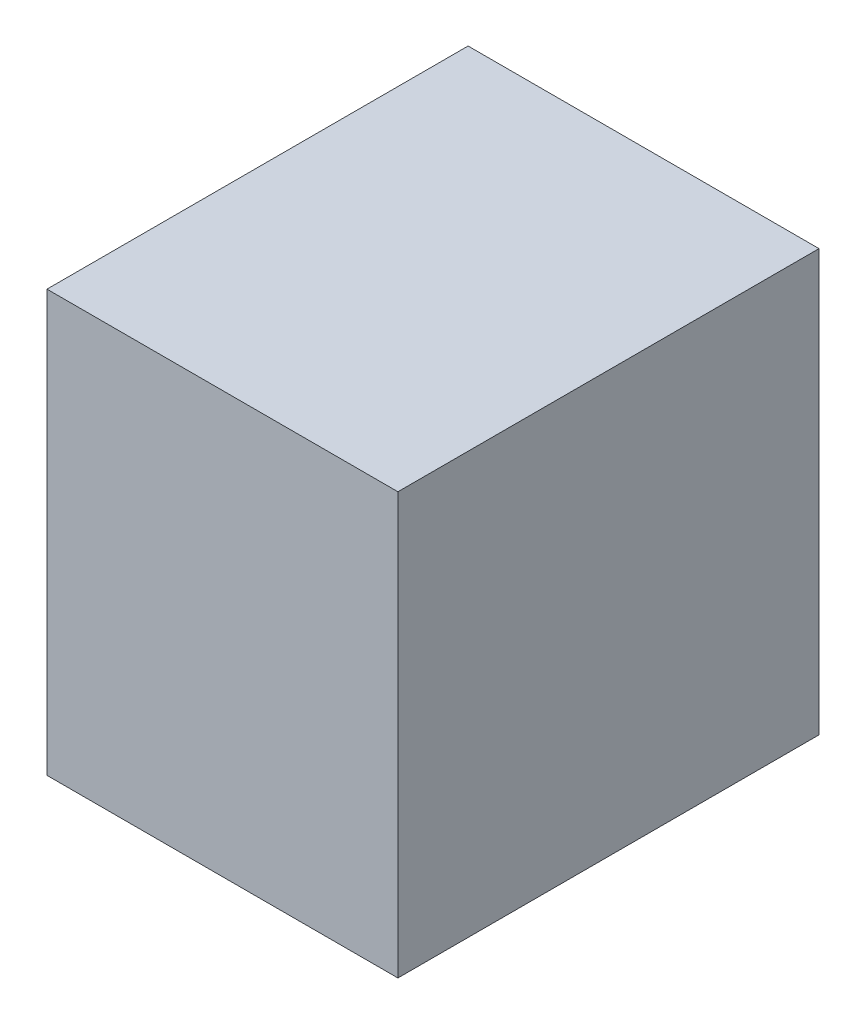
ISO-10303-21;
HEADER;
FILE_DESCRIPTION(('STEP AP214'),'2;1');
FILE_NAME('part.step','',(''),(''),'','','');
FILE_SCHEMA(('AUTOMOTIVE_DESIGN { 1 0 10303 214 1 1 1 1 }'));
ENDSEC;
DATA;
#1=APPLICATION_CONTEXT('core data for automotive mechanical design processes');
#2=APPLICATION_PROTOCOL_DEFINITION('international standard','automotive_design',2000,#1);
#3=PRODUCT_CONTEXT('',#1,'mechanical');
#4=PRODUCT('Part','Part','',(#3));
#5=PRODUCT_RELATED_PRODUCT_CATEGORY('part','',(#4));
#6=PRODUCT_DEFINITION_FORMATION('','',#4);
#7=PRODUCT_DEFINITION_CONTEXT('part definition',#1,'design');
#8=PRODUCT_DEFINITION('design','',#6,#7);
#9=PRODUCT_DEFINITION_SHAPE('','',#8);
#10=(LENGTH_UNIT() NAMED_UNIT(*) SI_UNIT(.MILLI.,.METRE.));
#11=(NAMED_UNIT(*) PLANE_ANGLE_UNIT() SI_UNIT($,.RADIAN.));
#12=(NAMED_UNIT(*) SI_UNIT($,.STERADIAN.) SOLID_ANGLE_UNIT());
#13=UNCERTAINTY_MEASURE_WITH_UNIT(LENGTH_MEASURE(1.E-05),#10,'distance_accuracy_value','');
#14=(GEOMETRIC_REPRESENTATION_CONTEXT(3) GLOBAL_UNCERTAINTY_ASSIGNED_CONTEXT((#13)) GLOBAL_UNIT_ASSIGNED_CONTEXT((#10,
#11,#12)) REPRESENTATION_CONTEXT('',''));
#15=CARTESIAN_POINT('',(0.,0.,0.));
#16=DIRECTION('',(0.,0.,1.));
#17=DIRECTION('',(1.,0.,0.));
#18=AXIS2_PLACEMENT_3D('',#15,#16,#17);
#19=CARTESIAN_POINT('',(325.,640.,-230.));
#20=DIRECTION('',(-1.,0.,0.));
#21=DIRECTION('',(0.,0.,1.));
#22=AXIS2_PLACEMENT_3D('',#19,#20,#21);
#23=PLANE('',#22);
#24=DIRECTION('',(0.,-1.,0.));
#25=VECTOR('',#24,1.);
#26=CARTESIAN_POINT('',(325.,640.,-170.));
#27=LINE('',#26,#25);
#28=CARTESIAN_POINT('',(325.,700.,-170.));
#29=VERTEX_POINT('',#28);
#30=CARTESIAN_POINT('',(325.,640.,-170.));
#31=VERTEX_POINT('',#30);
#32=EDGE_CURVE('E103',#29,#31,#27,.T.);
#33=ORIENTED_EDGE('',*,*,#32,.F.);
#34=DIRECTION('',(0.,0.,1.));
#35=VECTOR('',#34,1.);
#36=CARTESIAN_POINT('',(325.,700.,-230.));
#37=LINE('',#36,#35);
#38=CARTESIAN_POINT('',(325.,700.,-230.));
#39=VERTEX_POINT('',#38);
#40=EDGE_CURVE('E11',#39,#29,#37,.T.);
#41=ORIENTED_EDGE('',*,*,#40,.F.);
#42=DIRECTION('',(0.,-1.,0.));
#43=VECTOR('',#42,1.);
#44=CARTESIAN_POINT('',(325.,640.,-230.));
#45=LINE('',#44,#43);
#46=CARTESIAN_POINT('',(325.,640.,-230.));
#47=VERTEX_POINT('',#46);
#48=EDGE_CURVE('E97',#39,#47,#45,.T.);
#49=ORIENTED_EDGE('',*,*,#48,.T.);
#50=DIRECTION('',(0.,0.,1.));
#51=VECTOR('',#50,1.);
#52=CARTESIAN_POINT('',(325.,640.,-230.));
#53=LINE('',#52,#51);
#54=EDGE_CURVE('E42',#47,#31,#53,.T.);
#55=ORIENTED_EDGE('',*,*,#54,.T.);
#56=EDGE_LOOP('',(#33,#41,#49,#55));
#57=FACE_BOUND('',#56,.T.);
#58=ADVANCED_FACE('F39',(#57),#23,.T.);
#59=CARTESIAN_POINT('',(325.,700.,-230.));
#60=DIRECTION('',(0.,1.,0.));
#61=DIRECTION('',(0.,0.,1.));
#62=AXIS2_PLACEMENT_3D('',#59,#60,#61);
#63=PLANE('',#62);
#64=DIRECTION('',(-1.,0.,0.));
#65=VECTOR('',#64,1.);
#66=CARTESIAN_POINT('',(325.,700.,-170.));
#67=LINE('',#66,#65);
#68=CARTESIAN_POINT('',(375.,700.,-170.));
#69=VERTEX_POINT('',#68);
#70=EDGE_CURVE('E99',#69,#29,#67,.T.);
#71=ORIENTED_EDGE('',*,*,#70,.F.);
#72=DIRECTION('',(0.,0.,1.));
#73=VECTOR('',#72,1.);
#74=CARTESIAN_POINT('',(375.,700.,-230.));
#75=LINE('',#74,#73);
#76=CARTESIAN_POINT('',(375.,700.,-230.));
#77=VERTEX_POINT('',#76);
#78=EDGE_CURVE('E48',#77,#69,#75,.T.);
#79=ORIENTED_EDGE('',*,*,#78,.F.);
#80=DIRECTION('',(-1.,0.,0.));
#81=VECTOR('',#80,1.);
#82=CARTESIAN_POINT('',(325.,700.,-230.));
#83=LINE('',#82,#81);
#84=EDGE_CURVE('E94',#77,#39,#83,.T.);
#85=ORIENTED_EDGE('',*,*,#84,.T.);
#86=ORIENTED_EDGE('',*,*,#40,.T.);
#87=EDGE_LOOP('',(#71,#79,#85,#86));
#88=FACE_BOUND('',#87,.T.);
#89=ADVANCED_FACE('F113',(#88),#63,.T.);
#90=CARTESIAN_POINT('',(375.,640.,-230.));
#91=DIRECTION('',(1.,0.,0.));
#92=DIRECTION('',(0.,0.,-1.));
#93=AXIS2_PLACEMENT_3D('',#90,#91,#92);
#94=PLANE('',#93);
#95=DIRECTION('',(0.,1.,0.));
#96=VECTOR('',#95,1.);
#97=CARTESIAN_POINT('',(375.,640.,-170.));
#98=LINE('',#97,#96);
#99=CARTESIAN_POINT('',(375.,640.,-170.));
#100=VERTEX_POINT('',#99);
#101=EDGE_CURVE('E89',#100,#69,#98,.T.);
#102=ORIENTED_EDGE('',*,*,#101,.F.);
#103=DIRECTION('',(0.,0.,1.));
#104=VECTOR('',#103,1.);
#105=CARTESIAN_POINT('',(375.,640.,-230.));
#106=LINE('',#105,#104);
#107=CARTESIAN_POINT('',(375.,640.,-230.));
#108=VERTEX_POINT('',#107);
#109=EDGE_CURVE('E84',#108,#100,#106,.T.);
#110=ORIENTED_EDGE('',*,*,#109,.F.);
#111=DIRECTION('',(0.,1.,0.));
#112=VECTOR('',#111,1.);
#113=CARTESIAN_POINT('',(375.,640.,-230.));
#114=LINE('',#113,#112);
#115=EDGE_CURVE('E87',#108,#77,#114,.T.);
#116=ORIENTED_EDGE('',*,*,#115,.T.);
#117=ORIENTED_EDGE('',*,*,#78,.T.);
#118=EDGE_LOOP('',(#102,#110,#116,#117));
#119=FACE_BOUND('',#118,.T.);
#120=ADVANCED_FACE('F86',(#119),#94,.T.);
#121=CARTESIAN_POINT('',(325.,640.,-230.));
#122=DIRECTION('',(0.,-1.,0.));
#123=DIRECTION('',(0.,0.,-1.));
#124=AXIS2_PLACEMENT_3D('',#121,#122,#123);
#125=PLANE('',#124);
#126=DIRECTION('',(1.,0.,0.));
#127=VECTOR('',#126,1.);
#128=CARTESIAN_POINT('',(325.,640.,-170.));
#129=LINE('',#128,#127);
#130=EDGE_CURVE('E106',#31,#100,#129,.T.);
#131=ORIENTED_EDGE('',*,*,#130,.F.);
#132=ORIENTED_EDGE('',*,*,#54,.F.);
#133=DIRECTION('',(1.,0.,0.));
#134=VECTOR('',#133,1.);
#135=CARTESIAN_POINT('',(325.,640.,-230.));
#136=LINE('',#135,#134);
#137=EDGE_CURVE('E93',#47,#108,#136,.T.);
#138=ORIENTED_EDGE('',*,*,#137,.T.);
#139=ORIENTED_EDGE('',*,*,#109,.T.);
#140=EDGE_LOOP('',(#131,#132,#138,#139));
#141=FACE_BOUND('',#140,.T.);
#142=ADVANCED_FACE('F96',(#141),#125,.T.);
#143=CARTESIAN_POINT('',(0.,0.,-230.));
#144=DIRECTION('',(0.,0.,-1.));
#145=DIRECTION('',(-1.,0.,0.));
#146=AXIS2_PLACEMENT_3D('',#143,#144,#145);
#147=PLANE('',#146);
#148=ORIENTED_EDGE('',*,*,#48,.F.);
#149=ORIENTED_EDGE('',*,*,#84,.F.);
#150=ORIENTED_EDGE('',*,*,#115,.F.);
#151=ORIENTED_EDGE('',*,*,#137,.F.);
#152=EDGE_LOOP('',(#148,#149,#150,#151));
#153=FACE_BOUND('',#152,.T.);
#154=ADVANCED_FACE('F92',(#153),#147,.T.);
#155=CARTESIAN_POINT('',(0.,0.,-170.));
#156=DIRECTION('',(0.,0.,-1.));
#157=DIRECTION('',(-1.,0.,0.));
#158=AXIS2_PLACEMENT_3D('',#155,#156,#157);
#159=PLANE('',#158);
#160=ORIENTED_EDGE('',*,*,#32,.T.);
#161=ORIENTED_EDGE('',*,*,#130,.T.);
#162=ORIENTED_EDGE('',*,*,#101,.T.);
#163=ORIENTED_EDGE('',*,*,#70,.T.);
#164=EDGE_LOOP('',(#160,#161,#162,#163));
#165=FACE_BOUND('',#164,.T.);
#166=ADVANCED_FACE('F112',(#165),#159,.F.);
#167=CLOSED_SHELL('',(#58,#89,#120,#142,#154,#166));
#168=MANIFOLD_SOLID_BREP('B2',#167);
#169=ADVANCED_BREP_SHAPE_REPRESENTATION('',(#18,#168),#14);
#170=SHAPE_DEFINITION_REPRESENTATION(#9,#169);
ENDSEC;
END-ISO-10303-21;
